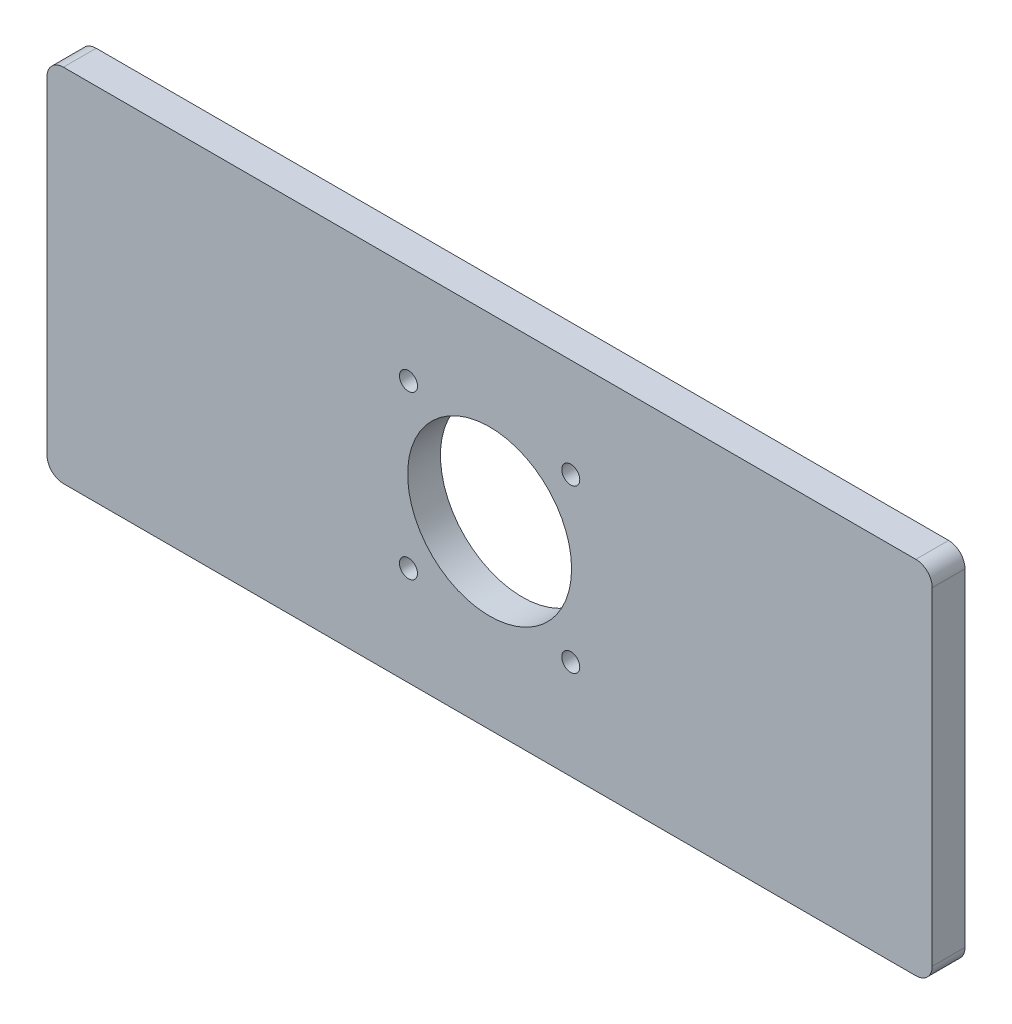
ISO-10303-21;
HEADER;
FILE_DESCRIPTION(('STEP AP214'),'2;1');
FILE_NAME('part.step','',(''),(''),'','','');
FILE_SCHEMA(('AUTOMOTIVE_DESIGN { 1 0 10303 214 1 1 1 1 }'));
ENDSEC;
DATA;
#1=APPLICATION_CONTEXT('core data for automotive mechanical design processes');
#2=APPLICATION_PROTOCOL_DEFINITION('international standard','automotive_design',2000,#1);
#3=PRODUCT_CONTEXT('',#1,'mechanical');
#4=PRODUCT('Part','Part','',(#3));
#5=PRODUCT_RELATED_PRODUCT_CATEGORY('part','',(#4));
#6=PRODUCT_DEFINITION_FORMATION('','',#4);
#7=PRODUCT_DEFINITION_CONTEXT('part definition',#1,'design');
#8=PRODUCT_DEFINITION('design','',#6,#7);
#9=PRODUCT_DEFINITION_SHAPE('','',#8);
#10=(LENGTH_UNIT() NAMED_UNIT(*) SI_UNIT(.MILLI.,.METRE.));
#11=(NAMED_UNIT(*) PLANE_ANGLE_UNIT() SI_UNIT($,.RADIAN.));
#12=(NAMED_UNIT(*) SI_UNIT($,.STERADIAN.) SOLID_ANGLE_UNIT());
#13=UNCERTAINTY_MEASURE_WITH_UNIT(LENGTH_MEASURE(1.E-05),#10,'distance_accuracy_value','');
#14=(GEOMETRIC_REPRESENTATION_CONTEXT(3) GLOBAL_UNCERTAINTY_ASSIGNED_CONTEXT((#13)) GLOBAL_UNIT_ASSIGNED_CONTEXT((#10,
#11,#12)) REPRESENTATION_CONTEXT('',''));
#15=CARTESIAN_POINT('',(0.,0.,0.));
#16=DIRECTION('',(0.,0.,1.));
#17=DIRECTION('',(1.,0.,0.));
#18=AXIS2_PLACEMENT_3D('',#15,#16,#17);
#19=CARTESIAN_POINT('',(210.,-50.,10.));
#20=DIRECTION('',(0.,0.,-1.));
#21=DIRECTION('',(-1.,0.,0.));
#22=AXIS2_PLACEMENT_3D('',#19,#20,#21);
#23=CYLINDRICAL_SURFACE('',#22,4.99999999999999);
#24=CARTESIAN_POINT('',(210.,-50.,0.));
#25=DIRECTION('',(0.,0.,1.));
#26=DIRECTION('',(1.,0.,0.));
#27=AXIS2_PLACEMENT_3D('',#24,#25,#26);
#28=CIRCLE('',#27,4.99999999999999);
#29=CARTESIAN_POINT('',(210.,-55.,0.));
#30=VERTEX_POINT('',#29);
#31=CARTESIAN_POINT('',(215.,-50.,0.));
#32=VERTEX_POINT('',#31);
#33=EDGE_CURVE('E128',#30,#32,#28,.T.);
#34=ORIENTED_EDGE('',*,*,#33,.T.);
#35=DIRECTION('',(0.,0.,-1.));
#36=VECTOR('',#35,1.);
#37=CARTESIAN_POINT('',(215.,-50.,10.));
#38=LINE('',#37,#36);
#39=CARTESIAN_POINT('',(215.,-50.,10.));
#40=VERTEX_POINT('',#39);
#41=EDGE_CURVE('E11',#40,#32,#38,.T.);
#42=ORIENTED_EDGE('',*,*,#41,.F.);
#43=CARTESIAN_POINT('',(210.,-50.,10.));
#44=DIRECTION('',(0.,0.,1.));
#45=DIRECTION('',(1.,0.,0.));
#46=AXIS2_PLACEMENT_3D('',#43,#44,#45);
#47=CIRCLE('',#46,4.99999999999999);
#48=CARTESIAN_POINT('',(210.,-55.,10.));
#49=VERTEX_POINT('',#48);
#50=EDGE_CURVE('E143',#49,#40,#47,.T.);
#51=ORIENTED_EDGE('',*,*,#50,.F.);
#52=DIRECTION('',(0.,0.,-1.));
#53=VECTOR('',#52,1.);
#54=CARTESIAN_POINT('',(210.,-55.,10.));
#55=LINE('',#54,#53);
#56=EDGE_CURVE('E124',#49,#30,#55,.T.);
#57=ORIENTED_EDGE('',*,*,#56,.T.);
#58=EDGE_LOOP('',(#34,#42,#51,#57));
#59=FACE_BOUND('',#58,.T.);
#60=ADVANCED_FACE('F32',(#59),#23,.T.);
#61=CARTESIAN_POINT('',(215.,50.,10.));
#62=DIRECTION('',(-1.,0.,0.));
#63=DIRECTION('',(0.,-1.,0.));
#64=AXIS2_PLACEMENT_3D('',#61,#62,#63);
#65=PLANE('',#64);
#66=DIRECTION('',(0.,1.,0.));
#67=VECTOR('',#66,1.);
#68=CARTESIAN_POINT('',(215.,50.,0.));
#69=LINE('',#68,#67);
#70=CARTESIAN_POINT('',(215.,50.,0.));
#71=VERTEX_POINT('',#70);
#72=EDGE_CURVE('E131',#32,#71,#69,.T.);
#73=ORIENTED_EDGE('',*,*,#72,.T.);
#74=DIRECTION('',(0.,0.,-1.));
#75=VECTOR('',#74,1.);
#76=CARTESIAN_POINT('',(215.,50.,10.));
#77=LINE('',#76,#75);
#78=CARTESIAN_POINT('',(215.,50.,10.));
#79=VERTEX_POINT('',#78);
#80=EDGE_CURVE('E40',#79,#71,#77,.T.);
#81=ORIENTED_EDGE('',*,*,#80,.F.);
#82=DIRECTION('',(0.,1.,0.));
#83=VECTOR('',#82,1.);
#84=CARTESIAN_POINT('',(215.,50.,10.));
#85=LINE('',#84,#83);
#86=EDGE_CURVE('E91',#40,#79,#85,.T.);
#87=ORIENTED_EDGE('',*,*,#86,.F.);
#88=ORIENTED_EDGE('',*,*,#41,.T.);
#89=EDGE_LOOP('',(#73,#81,#87,#88));
#90=FACE_BOUND('',#89,.T.);
#91=ADVANCED_FACE('F237',(#90),#65,.F.);
#92=CARTESIAN_POINT('',(210.,50.,10.));
#93=DIRECTION('',(0.,0.,-1.));
#94=DIRECTION('',(-1.,0.,0.));
#95=AXIS2_PLACEMENT_3D('',#92,#93,#94);
#96=CYLINDRICAL_SURFACE('',#95,5.);
#97=CARTESIAN_POINT('',(210.,50.,0.));
#98=DIRECTION('',(0.,0.,1.));
#99=DIRECTION('',(1.,0.,0.));
#100=AXIS2_PLACEMENT_3D('',#97,#98,#99);
#101=CIRCLE('',#100,5.);
#102=CARTESIAN_POINT('',(210.,55.,0.));
#103=VERTEX_POINT('',#102);
#104=EDGE_CURVE('E134',#71,#103,#101,.T.);
#105=ORIENTED_EDGE('',*,*,#104,.T.);
#106=DIRECTION('',(0.,0.,-1.));
#107=VECTOR('',#106,1.);
#108=CARTESIAN_POINT('',(210.,55.,10.));
#109=LINE('',#108,#107);
#110=CARTESIAN_POINT('',(210.,55.,10.));
#111=VERTEX_POINT('',#110);
#112=EDGE_CURVE('E150',#111,#103,#109,.T.);
#113=ORIENTED_EDGE('',*,*,#112,.F.);
#114=CARTESIAN_POINT('',(210.,50.,10.));
#115=DIRECTION('',(0.,0.,1.));
#116=DIRECTION('',(1.,0.,0.));
#117=AXIS2_PLACEMENT_3D('',#114,#115,#116);
#118=CIRCLE('',#117,5.);
#119=EDGE_CURVE('E158',#79,#111,#118,.T.);
#120=ORIENTED_EDGE('',*,*,#119,.F.);
#121=ORIENTED_EDGE('',*,*,#80,.T.);
#122=EDGE_LOOP('',(#105,#113,#120,#121));
#123=FACE_BOUND('',#122,.T.);
#124=ADVANCED_FACE('F156',(#123),#96,.T.);
#125=CARTESIAN_POINT('',(-50.,55.,10.));
#126=DIRECTION('',(0.,-1.,0.));
#127=DIRECTION('',(0.,0.,-1.));
#128=AXIS2_PLACEMENT_3D('',#125,#126,#127);
#129=PLANE('',#128);
#130=DIRECTION('',(-1.,0.,0.));
#131=VECTOR('',#130,1.);
#132=CARTESIAN_POINT('',(-50.,55.,0.));
#133=LINE('',#132,#131);
#134=CARTESIAN_POINT('',(-50.,55.,0.));
#135=VERTEX_POINT('',#134);
#136=EDGE_CURVE('E136',#103,#135,#133,.T.);
#137=ORIENTED_EDGE('',*,*,#136,.T.);
#138=DIRECTION('',(0.,0.,-1.));
#139=VECTOR('',#138,1.);
#140=CARTESIAN_POINT('',(-50.,55.,10.));
#141=LINE('',#140,#139);
#142=CARTESIAN_POINT('',(-50.,55.,10.));
#143=VERTEX_POINT('',#142);
#144=EDGE_CURVE('E147',#143,#135,#141,.T.);
#145=ORIENTED_EDGE('',*,*,#144,.F.);
#146=DIRECTION('',(-1.,0.,0.));
#147=VECTOR('',#146,1.);
#148=CARTESIAN_POINT('',(-50.,55.,10.));
#149=LINE('',#148,#147);
#150=EDGE_CURVE('E170',#111,#143,#149,.T.);
#151=ORIENTED_EDGE('',*,*,#150,.F.);
#152=ORIENTED_EDGE('',*,*,#112,.T.);
#153=EDGE_LOOP('',(#137,#145,#151,#152));
#154=FACE_BOUND('',#153,.T.);
#155=ADVANCED_FACE('F166',(#154),#129,.F.);
#156=CARTESIAN_POINT('',(-50.,50.,10.));
#157=DIRECTION('',(0.,0.,-1.));
#158=DIRECTION('',(-1.,0.,0.));
#159=AXIS2_PLACEMENT_3D('',#156,#157,#158);
#160=CYLINDRICAL_SURFACE('',#159,5.);
#161=CARTESIAN_POINT('',(-50.,50.,0.));
#162=DIRECTION('',(0.,0.,1.));
#163=DIRECTION('',(-1.,0.,0.));
#164=AXIS2_PLACEMENT_3D('',#161,#162,#163);
#165=CIRCLE('',#164,5.);
#166=CARTESIAN_POINT('',(-55.,50.,0.));
#167=VERTEX_POINT('',#166);
#168=EDGE_CURVE('E138',#135,#167,#165,.T.);
#169=ORIENTED_EDGE('',*,*,#168,.T.);
#170=DIRECTION('',(0.,0.,-1.));
#171=VECTOR('',#170,1.);
#172=CARTESIAN_POINT('',(-55.,50.,10.));
#173=LINE('',#172,#171);
#174=CARTESIAN_POINT('',(-55.,50.,10.));
#175=VERTEX_POINT('',#174);
#176=EDGE_CURVE('E119',#175,#167,#173,.T.);
#177=ORIENTED_EDGE('',*,*,#176,.F.);
#178=CARTESIAN_POINT('',(-50.,50.,10.));
#179=DIRECTION('',(0.,0.,1.));
#180=DIRECTION('',(-1.,0.,0.));
#181=AXIS2_PLACEMENT_3D('',#178,#179,#180);
#182=CIRCLE('',#181,5.);
#183=EDGE_CURVE('E110',#143,#175,#182,.T.);
#184=ORIENTED_EDGE('',*,*,#183,.F.);
#185=ORIENTED_EDGE('',*,*,#144,.T.);
#186=EDGE_LOOP('',(#169,#177,#184,#185));
#187=FACE_BOUND('',#186,.T.);
#188=ADVANCED_FACE('F169',(#187),#160,.T.);
#189=CARTESIAN_POINT('',(-55.,50.,10.));
#190=DIRECTION('',(1.,0.,0.));
#191=DIRECTION('',(0.,1.,0.));
#192=AXIS2_PLACEMENT_3D('',#189,#190,#191);
#193=PLANE('',#192);
#194=DIRECTION('',(0.,-1.,0.));
#195=VECTOR('',#194,1.);
#196=CARTESIAN_POINT('',(-55.,50.,0.));
#197=LINE('',#196,#195);
#198=CARTESIAN_POINT('',(-55.,-50.,0.));
#199=VERTEX_POINT('',#198);
#200=EDGE_CURVE('E118',#167,#199,#197,.T.);
#201=ORIENTED_EDGE('',*,*,#200,.T.);
#202=DIRECTION('',(0.,0.,-1.));
#203=VECTOR('',#202,1.);
#204=CARTESIAN_POINT('',(-55.,-50.,10.));
#205=LINE('',#204,#203);
#206=CARTESIAN_POINT('',(-55.,-50.,10.));
#207=VERTEX_POINT('',#206);
#208=EDGE_CURVE('E115',#207,#199,#205,.T.);
#209=ORIENTED_EDGE('',*,*,#208,.F.);
#210=DIRECTION('',(0.,-1.,0.));
#211=VECTOR('',#210,1.);
#212=CARTESIAN_POINT('',(-55.,50.,10.));
#213=LINE('',#212,#211);
#214=EDGE_CURVE('E104',#175,#207,#213,.T.);
#215=ORIENTED_EDGE('',*,*,#214,.F.);
#216=ORIENTED_EDGE('',*,*,#176,.T.);
#217=EDGE_LOOP('',(#201,#209,#215,#216));
#218=FACE_BOUND('',#217,.T.);
#219=ADVANCED_FACE('F116',(#218),#193,.F.);
#220=CARTESIAN_POINT('',(-50.,-50.,10.));
#221=DIRECTION('',(0.,0.,-1.));
#222=DIRECTION('',(-1.,0.,0.));
#223=AXIS2_PLACEMENT_3D('',#220,#221,#222);
#224=CYLINDRICAL_SURFACE('',#223,5.);
#225=CARTESIAN_POINT('',(-50.,-50.,0.));
#226=DIRECTION('',(0.,0.,1.));
#227=DIRECTION('',(1.,0.,0.));
#228=AXIS2_PLACEMENT_3D('',#225,#226,#227);
#229=CIRCLE('',#228,5.);
#230=CARTESIAN_POINT('',(-50.,-55.,0.));
#231=VERTEX_POINT('',#230);
#232=EDGE_CURVE('E77',#199,#231,#229,.T.);
#233=ORIENTED_EDGE('',*,*,#232,.T.);
#234=DIRECTION('',(0.,0.,-1.));
#235=VECTOR('',#234,1.);
#236=CARTESIAN_POINT('',(-50.,-55.,10.));
#237=LINE('',#236,#235);
#238=CARTESIAN_POINT('',(-50.,-55.,10.));
#239=VERTEX_POINT('',#238);
#240=EDGE_CURVE('E120',#239,#231,#237,.T.);
#241=ORIENTED_EDGE('',*,*,#240,.F.);
#242=CARTESIAN_POINT('',(-50.,-50.,10.));
#243=DIRECTION('',(0.,0.,1.));
#244=DIRECTION('',(1.,0.,0.));
#245=AXIS2_PLACEMENT_3D('',#242,#243,#244);
#246=CIRCLE('',#245,5.);
#247=EDGE_CURVE('E108',#207,#239,#246,.T.);
#248=ORIENTED_EDGE('',*,*,#247,.F.);
#249=ORIENTED_EDGE('',*,*,#208,.T.);
#250=EDGE_LOOP('',(#233,#241,#248,#249));
#251=FACE_BOUND('',#250,.T.);
#252=ADVANCED_FACE('F122',(#251),#224,.T.);
#253=CARTESIAN_POINT('',(-50.,-55.,10.));
#254=DIRECTION('',(0.,1.,0.));
#255=DIRECTION('',(-1.,0.,0.));
#256=AXIS2_PLACEMENT_3D('',#253,#254,#255);
#257=PLANE('',#256);
#258=DIRECTION('',(1.,0.,0.));
#259=VECTOR('',#258,1.);
#260=CARTESIAN_POINT('',(-50.,-55.,0.));
#261=LINE('',#260,#259);
#262=EDGE_CURVE('E83',#231,#30,#261,.T.);
#263=ORIENTED_EDGE('',*,*,#262,.T.);
#264=ORIENTED_EDGE('',*,*,#56,.F.);
#265=DIRECTION('',(1.,0.,0.));
#266=VECTOR('',#265,1.);
#267=CARTESIAN_POINT('',(-50.,-55.,10.));
#268=LINE('',#267,#266);
#269=EDGE_CURVE('E48',#239,#49,#268,.T.);
#270=ORIENTED_EDGE('',*,*,#269,.F.);
#271=ORIENTED_EDGE('',*,*,#240,.T.);
#272=EDGE_LOOP('',(#263,#264,#270,#271));
#273=FACE_BOUND('',#272,.T.);
#274=ADVANCED_FACE('F210',(#273),#257,.F.);
#275=CARTESIAN_POINT('',(210.,-50.,10.));
#276=DIRECTION('',(0.,0.,1.));
#277=DIRECTION('',(1.,0.,0.));
#278=AXIS2_PLACEMENT_3D('',#275,#276,#277);
#279=PLANE('',#278);
#280=CARTESIAN_POINT('',(55.2512626584729,24.7487373415297,10.));
#281=DIRECTION('',(0.,0.,1.));
#282=DIRECTION('',(1.,0.,0.));
#283=AXIS2_PLACEMENT_3D('',#280,#281,#282);
#284=CIRCLE('',#283,2.74999999999999);
#285=CARTESIAN_POINT('',(58.0012626584728,24.7487373415297,10.));
#286=VERTEX_POINT('',#285);
#287=EDGE_CURVE('E202',#286,#286,#284,.T.);
#288=ORIENTED_EDGE('',*,*,#287,.F.);
#289=EDGE_LOOP('',(#288));
#290=FACE_BOUND('',#289,.T.);
#291=CARTESIAN_POINT('',(104.748737341523,24.7487373415297,10.));
#292=DIRECTION('',(0.,0.,1.));
#293=DIRECTION('',(1.,0.,0.));
#294=AXIS2_PLACEMENT_3D('',#291,#292,#293);
#295=CIRCLE('',#294,2.74999999999999);
#296=CARTESIAN_POINT('',(107.498737341523,24.7487373415297,10.));
#297=VERTEX_POINT('',#296);
#298=EDGE_CURVE('E196',#297,#297,#295,.T.);
#299=ORIENTED_EDGE('',*,*,#298,.F.);
#300=EDGE_LOOP('',(#299));
#301=FACE_BOUND('',#300,.T.);
#302=CARTESIAN_POINT('',(104.748737341523,-24.7487373415303,10.));
#303=DIRECTION('',(0.,0.,1.));
#304=DIRECTION('',(1.,0.,0.));
#305=AXIS2_PLACEMENT_3D('',#302,#303,#304);
#306=CIRCLE('',#305,2.74999999999999);
#307=CARTESIAN_POINT('',(107.498737341523,-24.7487373415303,10.));
#308=VERTEX_POINT('',#307);
#309=EDGE_CURVE('E190',#308,#308,#306,.T.);
#310=ORIENTED_EDGE('',*,*,#309,.F.);
#311=EDGE_LOOP('',(#310));
#312=FACE_BOUND('',#311,.T.);
#313=CARTESIAN_POINT('',(55.2512626584729,-24.7487373415303,10.));
#314=DIRECTION('',(0.,0.,1.));
#315=DIRECTION('',(1.,0.,0.));
#316=AXIS2_PLACEMENT_3D('',#313,#314,#315);
#317=CIRCLE('',#316,2.74999999999999);
#318=CARTESIAN_POINT('',(58.0012626584728,-24.7487373415303,10.));
#319=VERTEX_POINT('',#318);
#320=EDGE_CURVE('E184',#319,#319,#317,.T.);
#321=ORIENTED_EDGE('',*,*,#320,.F.);
#322=EDGE_LOOP('',(#321));
#323=FACE_BOUND('',#322,.T.);
#324=CARTESIAN_POINT('',(80.0000000000001,0.,10.));
#325=DIRECTION('',(0.,0.,1.));
#326=DIRECTION('',(1.,0.,0.));
#327=AXIS2_PLACEMENT_3D('',#324,#325,#326);
#328=CIRCLE('',#327,25.);
#329=CARTESIAN_POINT('',(105.,0.,10.));
#330=VERTEX_POINT('',#329);
#331=EDGE_CURVE('E176',#330,#330,#328,.T.);
#332=ORIENTED_EDGE('',*,*,#331,.F.);
#333=EDGE_LOOP('',(#332));
#334=FACE_BOUND('',#333,.T.);
#335=ORIENTED_EDGE('',*,*,#50,.T.);
#336=ORIENTED_EDGE('',*,*,#86,.T.);
#337=ORIENTED_EDGE('',*,*,#119,.T.);
#338=ORIENTED_EDGE('',*,*,#150,.T.);
#339=ORIENTED_EDGE('',*,*,#183,.T.);
#340=ORIENTED_EDGE('',*,*,#214,.T.);
#341=ORIENTED_EDGE('',*,*,#247,.T.);
#342=ORIENTED_EDGE('',*,*,#269,.T.);
#343=EDGE_LOOP('',(#335,#336,#337,#338,#339,#340,#341,#342));
#344=FACE_BOUND('',#343,.T.);
#345=ADVANCED_FACE('F106',(#290,#301,#312,#323,#334,#344),#279,.T.);
#346=CARTESIAN_POINT('',(210.,-50.,0.));
#347=DIRECTION('',(0.,0.,1.));
#348=DIRECTION('',(1.,0.,0.));
#349=AXIS2_PLACEMENT_3D('',#346,#347,#348);
#350=PLANE('',#349);
#351=CARTESIAN_POINT('',(55.2512626584729,24.7487373415297,0.));
#352=DIRECTION('',(0.,0.,1.));
#353=DIRECTION('',(1.,0.,0.));
#354=AXIS2_PLACEMENT_3D('',#351,#352,#353);
#355=CIRCLE('',#354,2.74999999999989);
#356=CARTESIAN_POINT('',(58.0012626584727,24.7487373415297,0.));
#357=VERTEX_POINT('',#356);
#358=EDGE_CURVE('E199',#357,#357,#355,.T.);
#359=ORIENTED_EDGE('',*,*,#358,.T.);
#360=EDGE_LOOP('',(#359));
#361=FACE_BOUND('',#360,.T.);
#362=CARTESIAN_POINT('',(104.748737341523,24.7487373415297,0.));
#363=DIRECTION('',(0.,0.,1.));
#364=DIRECTION('',(1.,0.,0.));
#365=AXIS2_PLACEMENT_3D('',#362,#363,#364);
#366=CIRCLE('',#365,2.74999999999989);
#367=CARTESIAN_POINT('',(107.498737341523,24.7487373415297,0.));
#368=VERTEX_POINT('',#367);
#369=EDGE_CURVE('E193',#368,#368,#366,.T.);
#370=ORIENTED_EDGE('',*,*,#369,.T.);
#371=EDGE_LOOP('',(#370));
#372=FACE_BOUND('',#371,.T.);
#373=CARTESIAN_POINT('',(104.748737341523,-24.7487373415303,0.));
#374=DIRECTION('',(0.,0.,1.));
#375=DIRECTION('',(1.,0.,0.));
#376=AXIS2_PLACEMENT_3D('',#373,#374,#375);
#377=CIRCLE('',#376,2.74999999999989);
#378=CARTESIAN_POINT('',(107.498737341523,-24.7487373415303,0.));
#379=VERTEX_POINT('',#378);
#380=EDGE_CURVE('E187',#379,#379,#377,.T.);
#381=ORIENTED_EDGE('',*,*,#380,.T.);
#382=EDGE_LOOP('',(#381));
#383=FACE_BOUND('',#382,.T.);
#384=CARTESIAN_POINT('',(55.2512626584729,-24.7487373415303,0.));
#385=DIRECTION('',(0.,0.,1.));
#386=DIRECTION('',(1.,0.,0.));
#387=AXIS2_PLACEMENT_3D('',#384,#385,#386);
#388=CIRCLE('',#387,2.74999999999989);
#389=CARTESIAN_POINT('',(58.0012626584727,-24.7487373415303,0.));
#390=VERTEX_POINT('',#389);
#391=EDGE_CURVE('E179',#390,#390,#388,.T.);
#392=ORIENTED_EDGE('',*,*,#391,.T.);
#393=EDGE_LOOP('',(#392));
#394=FACE_BOUND('',#393,.T.);
#395=CARTESIAN_POINT('',(80.0000000000001,0.,0.));
#396=DIRECTION('',(0.,0.,1.));
#397=DIRECTION('',(1.,0.,0.));
#398=AXIS2_PLACEMENT_3D('',#395,#396,#397);
#399=CIRCLE('',#398,25.);
#400=CARTESIAN_POINT('',(105.,0.,0.));
#401=VERTEX_POINT('',#400);
#402=EDGE_CURVE('E132',#401,#401,#399,.T.);
#403=ORIENTED_EDGE('',*,*,#402,.T.);
#404=EDGE_LOOP('',(#403));
#405=FACE_BOUND('',#404,.T.);
#406=ORIENTED_EDGE('',*,*,#33,.F.);
#407=ORIENTED_EDGE('',*,*,#262,.F.);
#408=ORIENTED_EDGE('',*,*,#232,.F.);
#409=ORIENTED_EDGE('',*,*,#200,.F.);
#410=ORIENTED_EDGE('',*,*,#168,.F.);
#411=ORIENTED_EDGE('',*,*,#136,.F.);
#412=ORIENTED_EDGE('',*,*,#104,.F.);
#413=ORIENTED_EDGE('',*,*,#72,.F.);
#414=EDGE_LOOP('',(#406,#407,#408,#409,#410,#411,#412,#413));
#415=FACE_BOUND('',#414,.T.);
#416=ADVANCED_FACE('F162',(#361,#372,#383,#394,#405,#415),#350,.F.);
#417=CARTESIAN_POINT('',(80.0000000000001,0.,0.));
#418=DIRECTION('',(0.,0.,1.));
#419=DIRECTION('',(1.,0.,0.));
#420=AXIS2_PLACEMENT_3D('',#417,#418,#419);
#421=CYLINDRICAL_SURFACE('',#420,25.);
#422=ORIENTED_EDGE('',*,*,#402,.F.);
#423=EDGE_LOOP('',(#422));
#424=FACE_BOUND('',#423,.T.);
#425=ORIENTED_EDGE('',*,*,#331,.T.);
#426=EDGE_LOOP('',(#425));
#427=FACE_BOUND('',#426,.T.);
#428=ADVANCED_FACE('F220',(#424,#427),#421,.F.);
#429=CARTESIAN_POINT('',(55.2512626584729,-24.7487373415303,10.));
#430=DIRECTION('',(0.,0.,1.));
#431=DIRECTION('',(1.,0.,0.));
#432=AXIS2_PLACEMENT_3D('',#429,#430,#431);
#433=CYLINDRICAL_SURFACE('',#432,2.74999999999994);
#434=ORIENTED_EDGE('',*,*,#391,.F.);
#435=EDGE_LOOP('',(#434));
#436=FACE_BOUND('',#435,.T.);
#437=ORIENTED_EDGE('',*,*,#320,.T.);
#438=EDGE_LOOP('',(#437));
#439=FACE_BOUND('',#438,.T.);
#440=ADVANCED_FACE('F222',(#436,#439),#433,.F.);
#441=CARTESIAN_POINT('',(104.748737341523,-24.7487373415303,10.));
#442=DIRECTION('',(0.,0.,1.));
#443=DIRECTION('',(1.,0.,0.));
#444=AXIS2_PLACEMENT_3D('',#441,#442,#443);
#445=CYLINDRICAL_SURFACE('',#444,2.74999999999994);
#446=ORIENTED_EDGE('',*,*,#380,.F.);
#447=EDGE_LOOP('',(#446));
#448=FACE_BOUND('',#447,.T.);
#449=ORIENTED_EDGE('',*,*,#309,.T.);
#450=EDGE_LOOP('',(#449));
#451=FACE_BOUND('',#450,.T.);
#452=ADVANCED_FACE('F229',(#448,#451),#445,.F.);
#453=CARTESIAN_POINT('',(104.748737341523,24.7487373415297,10.));
#454=DIRECTION('',(0.,0.,1.));
#455=DIRECTION('',(1.,0.,0.));
#456=AXIS2_PLACEMENT_3D('',#453,#454,#455);
#457=CYLINDRICAL_SURFACE('',#456,2.74999999999994);
#458=ORIENTED_EDGE('',*,*,#369,.F.);
#459=EDGE_LOOP('',(#458));
#460=FACE_BOUND('',#459,.T.);
#461=ORIENTED_EDGE('',*,*,#298,.T.);
#462=EDGE_LOOP('',(#461));
#463=FACE_BOUND('',#462,.T.);
#464=ADVANCED_FACE('F308',(#460,#463),#457,.F.);
#465=CARTESIAN_POINT('',(55.2512626584729,24.7487373415297,10.));
#466=DIRECTION('',(0.,0.,1.));
#467=DIRECTION('',(1.,0.,0.));
#468=AXIS2_PLACEMENT_3D('',#465,#466,#467);
#469=CYLINDRICAL_SURFACE('',#468,2.74999999999994);
#470=ORIENTED_EDGE('',*,*,#358,.F.);
#471=EDGE_LOOP('',(#470));
#472=FACE_BOUND('',#471,.T.);
#473=ORIENTED_EDGE('',*,*,#287,.T.);
#474=EDGE_LOOP('',(#473));
#475=FACE_BOUND('',#474,.T.);
#476=ADVANCED_FACE('F206',(#472,#475),#469,.F.);
#477=CLOSED_SHELL('',(#60,#91,#124,#155,#188,#219,#252,#274,#345,#416,#428,#440,#452,#464,#476));
#478=MANIFOLD_SOLID_BREP('B2',#477);
#479=ADVANCED_BREP_SHAPE_REPRESENTATION('',(#18,#478),#14);
#480=SHAPE_DEFINITION_REPRESENTATION(#9,#479);
ENDSEC;
END-ISO-10303-21;
